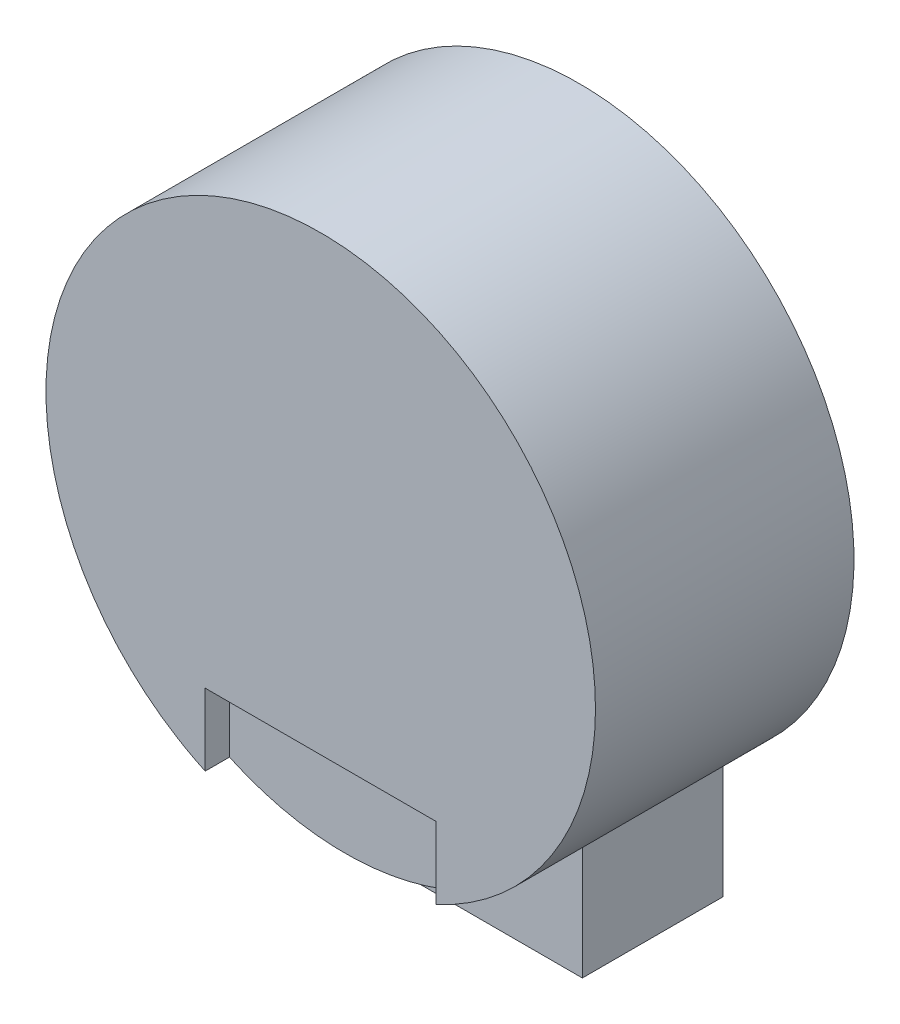
ISO-10303-21;
HEADER;
FILE_DESCRIPTION(('STEP AP214'),'2;1');
FILE_NAME('part.step','',(''),(''),'','','');
FILE_SCHEMA(('AUTOMOTIVE_DESIGN { 1 0 10303 214 1 1 1 1 }'));
ENDSEC;
DATA;
#1=APPLICATION_CONTEXT('core data for automotive mechanical design processes');
#2=APPLICATION_PROTOCOL_DEFINITION('international standard','automotive_design',2000,#1);
#3=PRODUCT_CONTEXT('',#1,'mechanical');
#4=PRODUCT('Part','Part','',(#3));
#5=PRODUCT_RELATED_PRODUCT_CATEGORY('part','',(#4));
#6=PRODUCT_DEFINITION_FORMATION('','',#4);
#7=PRODUCT_DEFINITION_CONTEXT('part definition',#1,'design');
#8=PRODUCT_DEFINITION('design','',#6,#7);
#9=PRODUCT_DEFINITION_SHAPE('','',#8);
#10=(LENGTH_UNIT() NAMED_UNIT(*) SI_UNIT(.MILLI.,.METRE.));
#11=(NAMED_UNIT(*) PLANE_ANGLE_UNIT() SI_UNIT($,.RADIAN.));
#12=(NAMED_UNIT(*) SI_UNIT($,.STERADIAN.) SOLID_ANGLE_UNIT());
#13=UNCERTAINTY_MEASURE_WITH_UNIT(LENGTH_MEASURE(1.E-05),#10,'distance_accuracy_value','');
#14=(GEOMETRIC_REPRESENTATION_CONTEXT(3) GLOBAL_UNCERTAINTY_ASSIGNED_CONTEXT((#13)) GLOBAL_UNIT_ASSIGNED_CONTEXT((#10,
#11,#12)) REPRESENTATION_CONTEXT('',''));
#15=CARTESIAN_POINT('',(0.,0.,0.));
#16=DIRECTION('',(0.,0.,1.));
#17=DIRECTION('',(1.,0.,0.));
#18=AXIS2_PLACEMENT_3D('',#15,#16,#17);
#19=CARTESIAN_POINT('',(0.,0.,2.25));
#20=DIRECTION('',(0.,0.,-1.));
#21=DIRECTION('',(-1.,0.,0.));
#22=AXIS2_PLACEMENT_3D('',#19,#20,#21);
#23=CYLINDRICAL_SURFACE('',#22,4.4);
#24=CARTESIAN_POINT('',(0.,0.,0.));
#25=DIRECTION('',(0.,0.,1.));
#26=DIRECTION('',(1.,0.,0.));
#27=AXIS2_PLACEMENT_3D('',#24,#25,#26);
#28=CIRCLE('',#27,4.4);
#29=CARTESIAN_POINT('',(2.3,-3.75099986670221,0.));
#30=VERTEX_POINT('',#29);
#31=CARTESIAN_POINT('',(-2.3,-3.75099986670221,0.));
#32=VERTEX_POINT('',#31);
#33=EDGE_CURVE('E214',#30,#32,#28,.T.);
#34=ORIENTED_EDGE('',*,*,#33,.T.);
#35=DIRECTION('',(0.,0.,-1.));
#36=VECTOR('',#35,1.);
#37=CARTESIAN_POINT('',(-2.3,-3.75099986670221,2.25));
#38=LINE('',#37,#36);
#39=CARTESIAN_POINT('',(-2.3,-3.75099986670221,2.25));
#40=VERTEX_POINT('',#39);
#41=EDGE_CURVE('E171',#40,#32,#38,.T.);
#42=ORIENTED_EDGE('',*,*,#41,.F.);
#43=CARTESIAN_POINT('',(0.,0.,2.25));
#44=DIRECTION('',(0.,0.,1.));
#45=DIRECTION('',(1.,0.,0.));
#46=AXIS2_PLACEMENT_3D('',#43,#44,#45);
#47=CIRCLE('',#46,4.4);
#48=CARTESIAN_POINT('',(2.3,-3.75099986670221,2.25));
#49=VERTEX_POINT('',#48);
#50=EDGE_CURVE('E151',#40,#49,#47,.T.);
#51=ORIENTED_EDGE('',*,*,#50,.T.);
#52=DIRECTION('',(0.,0.,-1.));
#53=VECTOR('',#52,1.);
#54=CARTESIAN_POINT('',(2.3,-3.75099986670221,2.25));
#55=LINE('',#54,#53);
#56=EDGE_CURVE('E177',#49,#30,#55,.T.);
#57=ORIENTED_EDGE('',*,*,#56,.T.);
#58=EDGE_LOOP('',(#34,#42,#51,#57));
#59=FACE_BOUND('',#58,.T.);
#60=CARTESIAN_POINT('',(0.,0.,3.75133301182728));
#61=DIRECTION('',(0.,0.,-1.));
#62=DIRECTION('',(-1.,0.,0.));
#63=AXIS2_PLACEMENT_3D('',#60,#61,#62);
#64=CIRCLE('',#63,4.4);
#65=CARTESIAN_POINT('',(1.85,-3.99217985566783,3.75133301182728));
#66=VERTEX_POINT('',#65);
#67=CARTESIAN_POINT('',(-1.85,-3.99217985566783,3.75133301182728));
#68=VERTEX_POINT('',#67);
#69=EDGE_CURVE('E11',#66,#68,#64,.T.);
#70=ORIENTED_EDGE('',*,*,#69,.T.);
#71=DIRECTION('',(0.,0.,-1.));
#72=VECTOR('',#71,1.);
#73=CARTESIAN_POINT('',(-1.85,-3.99217985566783,2.25));
#74=LINE('',#73,#72);
#75=CARTESIAN_POINT('',(-1.85,-3.99217985566783,4.14));
#76=VERTEX_POINT('',#75);
#77=EDGE_CURVE('E137',#68,#76,#74,.F.);
#78=ORIENTED_EDGE('',*,*,#77,.T.);
#79=CARTESIAN_POINT('',(0.,0.,4.14));
#80=DIRECTION('',(0.,0.,1.));
#81=DIRECTION('',(1.,0.,0.));
#82=AXIS2_PLACEMENT_3D('',#79,#80,#81);
#83=CIRCLE('',#82,4.4);
#84=CARTESIAN_POINT('',(1.85,-3.99217985566783,4.14));
#85=VERTEX_POINT('',#84);
#86=EDGE_CURVE('E152',#85,#76,#83,.T.);
#87=ORIENTED_EDGE('',*,*,#86,.F.);
#88=DIRECTION('',(0.,0.,-1.));
#89=VECTOR('',#88,1.);
#90=CARTESIAN_POINT('',(1.85,-3.99217985566783,2.25));
#91=LINE('',#90,#89);
#92=EDGE_CURVE('E146',#85,#66,#91,.T.);
#93=ORIENTED_EDGE('',*,*,#92,.T.);
#94=EDGE_LOOP('',(#70,#78,#87,#93));
#95=FACE_BOUND('',#94,.T.);
#96=ADVANCED_FACE('F36',(#59,#95),#23,.T.);
#97=CARTESIAN_POINT('',(-2.3,0.,2.25));
#98=DIRECTION('',(-1.,0.,0.));
#99=DIRECTION('',(0.,0.,1.));
#100=AXIS2_PLACEMENT_3D('',#97,#98,#99);
#101=PLANE('',#100);
#102=DIRECTION('',(0.,1.,0.));
#103=VECTOR('',#102,1.);
#104=CARTESIAN_POINT('',(-2.3,0.,0.));
#105=LINE('',#104,#103);
#106=CARTESIAN_POINT('',(-2.3,-5.73099986670221,0.));
#107=VERTEX_POINT('',#106);
#108=EDGE_CURVE('E220',#107,#32,#105,.T.);
#109=ORIENTED_EDGE('',*,*,#108,.F.);
#110=DIRECTION('',(0.,0.,-1.));
#111=VECTOR('',#110,1.);
#112=CARTESIAN_POINT('',(-2.3,-5.73099986670221,2.25));
#113=LINE('',#112,#111);
#114=CARTESIAN_POINT('',(-2.3,-5.73099986670221,2.25));
#115=VERTEX_POINT('',#114);
#116=EDGE_CURVE('E163',#115,#107,#113,.T.);
#117=ORIENTED_EDGE('',*,*,#116,.F.);
#118=DIRECTION('',(0.,1.,0.));
#119=VECTOR('',#118,1.);
#120=CARTESIAN_POINT('',(-2.3,0.,2.25));
#121=LINE('',#120,#119);
#122=EDGE_CURVE('E165',#115,#40,#121,.T.);
#123=ORIENTED_EDGE('',*,*,#122,.T.);
#124=ORIENTED_EDGE('',*,*,#41,.T.);
#125=EDGE_LOOP('',(#109,#117,#123,#124));
#126=FACE_BOUND('',#125,.T.);
#127=ADVANCED_FACE('F204',(#126),#101,.T.);
#128=CARTESIAN_POINT('',(0.,-5.73099986670221,2.25));
#129=DIRECTION('',(0.,1.,0.));
#130=DIRECTION('',(0.,0.,1.));
#131=AXIS2_PLACEMENT_3D('',#128,#129,#130);
#132=PLANE('',#131);
#133=DIRECTION('',(1.,0.,0.));
#134=VECTOR('',#133,1.);
#135=CARTESIAN_POINT('',(1.75,-5.73099986670221,0.7));
#136=LINE('',#135,#134);
#137=CARTESIAN_POINT('',(-1.75,-5.73099986670221,0.7));
#138=VERTEX_POINT('',#137);
#139=CARTESIAN_POINT('',(1.75,-5.73099986670221,0.7));
#140=VERTEX_POINT('',#139);
#141=EDGE_CURVE('E389',#138,#140,#136,.T.);
#142=ORIENTED_EDGE('',*,*,#141,.F.);
#143=DIRECTION('',(0.,0.,-1.));
#144=VECTOR('',#143,1.);
#145=CARTESIAN_POINT('',(-1.75,-5.73099986670221,1.2));
#146=LINE('',#145,#144);
#147=CARTESIAN_POINT('',(-1.75,-5.73099986670221,1.2));
#148=VERTEX_POINT('',#147);
#149=EDGE_CURVE('E58',#148,#138,#146,.T.);
#150=ORIENTED_EDGE('',*,*,#149,.F.);
#151=DIRECTION('',(-1.,0.,0.));
#152=VECTOR('',#151,1.);
#153=CARTESIAN_POINT('',(1.75,-5.73099986670221,1.2));
#154=LINE('',#153,#152);
#155=CARTESIAN_POINT('',(1.75,-5.73099986670221,1.2));
#156=VERTEX_POINT('',#155);
#157=EDGE_CURVE('E382',#156,#148,#154,.T.);
#158=ORIENTED_EDGE('',*,*,#157,.F.);
#159=DIRECTION('',(0.,0.,1.));
#160=VECTOR('',#159,1.);
#161=CARTESIAN_POINT('',(1.75,-5.73099986670221,1.2));
#162=LINE('',#161,#160);
#163=EDGE_CURVE('E385',#140,#156,#162,.T.);
#164=ORIENTED_EDGE('',*,*,#163,.F.);
#165=EDGE_LOOP('',(#142,#150,#158,#164));
#166=FACE_BOUND('',#165,.T.);
#167=DIRECTION('',(1.,0.,0.));
#168=VECTOR('',#167,1.);
#169=CARTESIAN_POINT('',(0.,-5.73099986670221,0.));
#170=LINE('',#169,#168);
#171=CARTESIAN_POINT('',(2.3,-5.73099986670221,0.));
#172=VERTEX_POINT('',#171);
#173=EDGE_CURVE('E226',#107,#172,#170,.T.);
#174=ORIENTED_EDGE('',*,*,#173,.T.);
#175=DIRECTION('',(0.,0.,-1.));
#176=VECTOR('',#175,1.);
#177=CARTESIAN_POINT('',(2.3,-5.73099986670221,2.25));
#178=LINE('',#177,#176);
#179=CARTESIAN_POINT('',(2.3,-5.73099986670221,2.25));
#180=VERTEX_POINT('',#179);
#181=EDGE_CURVE('E182',#180,#172,#178,.T.);
#182=ORIENTED_EDGE('',*,*,#181,.F.);
#183=DIRECTION('',(1.,0.,0.));
#184=VECTOR('',#183,1.);
#185=CARTESIAN_POINT('',(0.,-5.73099986670221,2.25));
#186=LINE('',#185,#184);
#187=EDGE_CURVE('E167',#115,#180,#186,.T.);
#188=ORIENTED_EDGE('',*,*,#187,.F.);
#189=ORIENTED_EDGE('',*,*,#116,.T.);
#190=EDGE_LOOP('',(#174,#182,#188,#189));
#191=FACE_BOUND('',#190,.T.);
#192=ADVANCED_FACE('F209',(#166,#191),#132,.F.);
#193=CARTESIAN_POINT('',(2.3,0.,2.25));
#194=DIRECTION('',(-1.,0.,0.));
#195=DIRECTION('',(0.,0.,1.));
#196=AXIS2_PLACEMENT_3D('',#193,#194,#195);
#197=PLANE('',#196);
#198=DIRECTION('',(0.,1.,0.));
#199=VECTOR('',#198,1.);
#200=CARTESIAN_POINT('',(2.3,0.,0.));
#201=LINE('',#200,#199);
#202=EDGE_CURVE('E168',#172,#30,#201,.T.);
#203=ORIENTED_EDGE('',*,*,#202,.T.);
#204=ORIENTED_EDGE('',*,*,#56,.F.);
#205=DIRECTION('',(0.,1.,0.));
#206=VECTOR('',#205,1.);
#207=CARTESIAN_POINT('',(2.3,0.,2.25));
#208=LINE('',#207,#206);
#209=EDGE_CURVE('E175',#180,#49,#208,.T.);
#210=ORIENTED_EDGE('',*,*,#209,.F.);
#211=ORIENTED_EDGE('',*,*,#181,.T.);
#212=EDGE_LOOP('',(#203,#204,#210,#211));
#213=FACE_BOUND('',#212,.T.);
#214=ADVANCED_FACE('F240',(#213),#197,.F.);
#215=CARTESIAN_POINT('',(0.,0.,2.25));
#216=DIRECTION('',(0.,0.,1.));
#217=DIRECTION('',(1.,0.,0.));
#218=AXIS2_PLACEMENT_3D('',#215,#216,#217);
#219=PLANE('',#218);
#220=ORIENTED_EDGE('',*,*,#50,.F.);
#221=ORIENTED_EDGE('',*,*,#122,.F.);
#222=ORIENTED_EDGE('',*,*,#187,.T.);
#223=ORIENTED_EDGE('',*,*,#209,.T.);
#224=EDGE_LOOP('',(#220,#221,#222,#223));
#225=FACE_BOUND('',#224,.T.);
#226=ADVANCED_FACE('F239',(#225),#219,.T.);
#227=CARTESIAN_POINT('',(0.,0.,0.));
#228=DIRECTION('',(0.,0.,1.));
#229=DIRECTION('',(1.,0.,0.));
#230=AXIS2_PLACEMENT_3D('',#227,#228,#229);
#231=PLANE('',#230);
#232=ORIENTED_EDGE('',*,*,#33,.F.);
#233=ORIENTED_EDGE('',*,*,#202,.F.);
#234=ORIENTED_EDGE('',*,*,#173,.F.);
#235=ORIENTED_EDGE('',*,*,#108,.T.);
#236=EDGE_LOOP('',(#232,#233,#234,#235));
#237=FACE_BOUND('',#236,.T.);
#238=ADVANCED_FACE('F225',(#237),#231,.F.);
#239=CARTESIAN_POINT('',(-1.75,-2.4418729391811,1.2));
#240=DIRECTION('',(-1.,0.,0.));
#241=DIRECTION('',(0.,0.,1.));
#242=AXIS2_PLACEMENT_3D('',#239,#240,#241);
#243=PLANE('',#242);
#244=ORIENTED_EDGE('',*,*,#149,.T.);
#245=DIRECTION('',(0.,-1.,0.));
#246=VECTOR('',#245,1.);
#247=CARTESIAN_POINT('',(-1.75,-2.4418729391811,0.7));
#248=LINE('',#247,#246);
#249=CARTESIAN_POINT('',(-1.75,-2.4418729391811,0.7));
#250=VERTEX_POINT('',#249);
#251=EDGE_CURVE('E398',#250,#138,#248,.T.);
#252=ORIENTED_EDGE('',*,*,#251,.F.);
#253=DIRECTION('',(0.,0.,-1.));
#254=VECTOR('',#253,1.);
#255=CARTESIAN_POINT('',(-1.75,-2.4418729391811,1.2));
#256=LINE('',#255,#254);
#257=CARTESIAN_POINT('',(-1.75,-2.4418729391811,1.2));
#258=VERTEX_POINT('',#257);
#259=EDGE_CURVE('E158',#258,#250,#256,.T.);
#260=ORIENTED_EDGE('',*,*,#259,.F.);
#261=DIRECTION('',(0.,-1.,0.));
#262=VECTOR('',#261,1.);
#263=CARTESIAN_POINT('',(-1.75,-2.4418729391811,1.2));
#264=LINE('',#263,#262);
#265=EDGE_CURVE('E221',#258,#148,#264,.T.);
#266=ORIENTED_EDGE('',*,*,#265,.T.);
#267=EDGE_LOOP('',(#244,#252,#260,#266));
#268=FACE_BOUND('',#267,.T.);
#269=ADVANCED_FACE('F252',(#268),#243,.F.);
#270=CARTESIAN_POINT('',(1.75,-2.4418729391811,1.2));
#271=DIRECTION('',(0.,0.,1.));
#272=DIRECTION('',(1.,0.,0.));
#273=AXIS2_PLACEMENT_3D('',#270,#271,#272);
#274=PLANE('',#273);
#275=ORIENTED_EDGE('',*,*,#157,.T.);
#276=ORIENTED_EDGE('',*,*,#265,.F.);
#277=DIRECTION('',(-1.,0.,0.));
#278=VECTOR('',#277,1.);
#279=CARTESIAN_POINT('',(1.75,-2.4418729391811,1.2));
#280=LINE('',#279,#278);
#281=CARTESIAN_POINT('',(1.75,-2.4418729391811,1.2));
#282=VERTEX_POINT('',#281);
#283=EDGE_CURVE('E381',#282,#258,#280,.T.);
#284=ORIENTED_EDGE('',*,*,#283,.F.);
#285=DIRECTION('',(0.,-1.,0.));
#286=VECTOR('',#285,1.);
#287=CARTESIAN_POINT('',(1.75,-2.4418729391811,1.2));
#288=LINE('',#287,#286);
#289=EDGE_CURVE('E394',#282,#156,#288,.T.);
#290=ORIENTED_EDGE('',*,*,#289,.T.);
#291=EDGE_LOOP('',(#275,#276,#284,#290));
#292=FACE_BOUND('',#291,.T.);
#293=ADVANCED_FACE('F256',(#292),#274,.F.);
#294=CARTESIAN_POINT('',(1.75,-2.4418729391811,1.2));
#295=DIRECTION('',(1.,0.,0.));
#296=DIRECTION('',(0.,0.,-1.));
#297=AXIS2_PLACEMENT_3D('',#294,#295,#296);
#298=PLANE('',#297);
#299=ORIENTED_EDGE('',*,*,#163,.T.);
#300=ORIENTED_EDGE('',*,*,#289,.F.);
#301=DIRECTION('',(0.,0.,1.));
#302=VECTOR('',#301,1.);
#303=CARTESIAN_POINT('',(1.75,-2.4418729391811,1.2));
#304=LINE('',#303,#302);
#305=CARTESIAN_POINT('',(1.75,-2.4418729391811,0.7));
#306=VERTEX_POINT('',#305);
#307=EDGE_CURVE('E383',#306,#282,#304,.T.);
#308=ORIENTED_EDGE('',*,*,#307,.F.);
#309=DIRECTION('',(0.,-1.,0.));
#310=VECTOR('',#309,1.);
#311=CARTESIAN_POINT('',(1.75,-2.4418729391811,0.7));
#312=LINE('',#311,#310);
#313=EDGE_CURVE('E396',#306,#140,#312,.T.);
#314=ORIENTED_EDGE('',*,*,#313,.T.);
#315=EDGE_LOOP('',(#299,#300,#308,#314));
#316=FACE_BOUND('',#315,.T.);
#317=ADVANCED_FACE('F261',(#316),#298,.F.);
#318=CARTESIAN_POINT('',(1.75,-2.4418729391811,0.7));
#319=DIRECTION('',(0.,0.,-1.));
#320=DIRECTION('',(-1.,0.,0.));
#321=AXIS2_PLACEMENT_3D('',#318,#319,#320);
#322=PLANE('',#321);
#323=ORIENTED_EDGE('',*,*,#141,.T.);
#324=ORIENTED_EDGE('',*,*,#313,.F.);
#325=DIRECTION('',(1.,0.,0.));
#326=VECTOR('',#325,1.);
#327=CARTESIAN_POINT('',(1.75,-2.4418729391811,0.7));
#328=LINE('',#327,#326);
#329=EDGE_CURVE('E379',#250,#306,#328,.T.);
#330=ORIENTED_EDGE('',*,*,#329,.F.);
#331=ORIENTED_EDGE('',*,*,#251,.T.);
#332=EDGE_LOOP('',(#323,#324,#330,#331));
#333=FACE_BOUND('',#332,.T.);
#334=ADVANCED_FACE('F257',(#333),#322,.F.);
#335=CARTESIAN_POINT('',(0.,-2.4418729391811,0.));
#336=DIRECTION('',(0.,1.,0.));
#337=DIRECTION('',(0.,0.,1.));
#338=AXIS2_PLACEMENT_3D('',#335,#336,#337);
#339=PLANE('',#338);
#340=ORIENTED_EDGE('',*,*,#259,.T.);
#341=ORIENTED_EDGE('',*,*,#329,.T.);
#342=ORIENTED_EDGE('',*,*,#307,.T.);
#343=ORIENTED_EDGE('',*,*,#283,.T.);
#344=EDGE_LOOP('',(#340,#341,#342,#343));
#345=FACE_BOUND('',#344,.T.);
#346=ADVANCED_FACE('F260',(#345),#339,.F.);
#347=CARTESIAN_POINT('',(0.,0.,4.14));
#348=DIRECTION('',(0.,0.,1.));
#349=DIRECTION('',(1.,0.,0.));
#350=AXIS2_PLACEMENT_3D('',#347,#348,#349);
#351=PLANE('',#350);
#352=DIRECTION('',(0.,-1.,0.));
#353=VECTOR('',#352,1.);
#354=CARTESIAN_POINT('',(-1.85,0.,4.14));
#355=LINE('',#354,#353);
#356=CARTESIAN_POINT('',(-1.85,-2.84099986670221,4.14));
#357=VERTEX_POINT('',#356);
#358=EDGE_CURVE('E43',#357,#76,#355,.T.);
#359=ORIENTED_EDGE('',*,*,#358,.F.);
#360=DIRECTION('',(-1.,0.,0.));
#361=VECTOR('',#360,1.);
#362=CARTESIAN_POINT('',(0.,-2.84099986670221,4.14));
#363=LINE('',#362,#361);
#364=CARTESIAN_POINT('',(1.85,-2.84099986670221,4.14));
#365=VERTEX_POINT('',#364);
#366=EDGE_CURVE('E129',#365,#357,#363,.T.);
#367=ORIENTED_EDGE('',*,*,#366,.F.);
#368=DIRECTION('',(0.,1.,0.));
#369=VECTOR('',#368,1.);
#370=CARTESIAN_POINT('',(1.85,0.,4.14));
#371=LINE('',#370,#369);
#372=EDGE_CURVE('E186',#85,#365,#371,.T.);
#373=ORIENTED_EDGE('',*,*,#372,.F.);
#374=ORIENTED_EDGE('',*,*,#86,.T.);
#375=EDGE_LOOP('',(#359,#367,#373,#374));
#376=FACE_BOUND('',#375,.T.);
#377=ADVANCED_FACE('F191',(#376),#351,.T.);
#378=CARTESIAN_POINT('',(1.85,-2.84099986670221,3.75133301182728));
#379=DIRECTION('',(0.,0.,-1.));
#380=DIRECTION('',(-1.,0.,0.));
#381=AXIS2_PLACEMENT_3D('',#378,#379,#380);
#382=PLANE('',#381);
#383=DIRECTION('',(0.,-1.,0.));
#384=VECTOR('',#383,1.);
#385=CARTESIAN_POINT('',(1.85,-2.84099986670221,3.75133301182728));
#386=LINE('',#385,#384);
#387=CARTESIAN_POINT('',(1.85,-2.84099986670221,3.75133301182728));
#388=VERTEX_POINT('',#387);
#389=EDGE_CURVE('E139',#388,#66,#386,.T.);
#390=ORIENTED_EDGE('',*,*,#389,.F.);
#391=DIRECTION('',(1.,0.,0.));
#392=VECTOR('',#391,1.);
#393=CARTESIAN_POINT('',(1.85,-2.84099986670221,3.75133301182728));
#394=LINE('',#393,#392);
#395=CARTESIAN_POINT('',(-1.85,-2.84099986670221,3.75133301182728));
#396=VERTEX_POINT('',#395);
#397=EDGE_CURVE('E127',#396,#388,#394,.T.);
#398=ORIENTED_EDGE('',*,*,#397,.F.);
#399=DIRECTION('',(0.,-1.,0.));
#400=VECTOR('',#399,1.);
#401=CARTESIAN_POINT('',(-1.85,-2.84099986670221,3.75133301182728));
#402=LINE('',#401,#400);
#403=EDGE_CURVE('E134',#396,#68,#402,.T.);
#404=ORIENTED_EDGE('',*,*,#403,.T.);
#405=ORIENTED_EDGE('',*,*,#69,.F.);
#406=EDGE_LOOP('',(#390,#398,#404,#405));
#407=FACE_BOUND('',#406,.T.);
#408=ADVANCED_FACE('F141',(#407),#382,.F.);
#409=CARTESIAN_POINT('',(-1.85,-2.84099986670221,5.03940543007619));
#410=DIRECTION('',(-1.,0.,0.));
#411=DIRECTION('',(0.,0.,1.));
#412=AXIS2_PLACEMENT_3D('',#409,#410,#411);
#413=PLANE('',#412);
#414=ORIENTED_EDGE('',*,*,#403,.F.);
#415=DIRECTION('',(0.,0.,-1.));
#416=VECTOR('',#415,1.);
#417=CARTESIAN_POINT('',(-1.85,-2.84099986670221,5.03940543007619));
#418=LINE('',#417,#416);
#419=EDGE_CURVE('E123',#357,#396,#418,.T.);
#420=ORIENTED_EDGE('',*,*,#419,.F.);
#421=ORIENTED_EDGE('',*,*,#358,.T.);
#422=ORIENTED_EDGE('',*,*,#77,.F.);
#423=EDGE_LOOP('',(#414,#420,#421,#422));
#424=FACE_BOUND('',#423,.T.);
#425=ADVANCED_FACE('F135',(#424),#413,.F.);
#426=CARTESIAN_POINT('',(1.85,-2.84099986670221,5.03940543007619));
#427=DIRECTION('',(1.,0.,0.));
#428=DIRECTION('',(0.,0.,-1.));
#429=AXIS2_PLACEMENT_3D('',#426,#427,#428);
#430=PLANE('',#429);
#431=ORIENTED_EDGE('',*,*,#372,.T.);
#432=DIRECTION('',(0.,0.,1.));
#433=VECTOR('',#432,1.);
#434=CARTESIAN_POINT('',(1.85,-2.84099986670221,5.03940543007619));
#435=LINE('',#434,#433);
#436=EDGE_CURVE('E50',#388,#365,#435,.T.);
#437=ORIENTED_EDGE('',*,*,#436,.F.);
#438=ORIENTED_EDGE('',*,*,#389,.T.);
#439=ORIENTED_EDGE('',*,*,#92,.F.);
#440=EDGE_LOOP('',(#431,#437,#438,#439));
#441=FACE_BOUND('',#440,.T.);
#442=ADVANCED_FACE('F193',(#441),#430,.F.);
#443=CARTESIAN_POINT('',(0.,-2.84099986670221,0.));
#444=DIRECTION('',(0.,1.,0.));
#445=DIRECTION('',(0.,0.,1.));
#446=AXIS2_PLACEMENT_3D('',#443,#444,#445);
#447=PLANE('',#446);
#448=ORIENTED_EDGE('',*,*,#366,.T.);
#449=ORIENTED_EDGE('',*,*,#419,.T.);
#450=ORIENTED_EDGE('',*,*,#397,.T.);
#451=ORIENTED_EDGE('',*,*,#436,.T.);
#452=EDGE_LOOP('',(#448,#449,#450,#451));
#453=FACE_BOUND('',#452,.T.);
#454=ADVANCED_FACE('F125',(#453),#447,.F.);
#455=CLOSED_SHELL('',(#96,#127,#192,#214,#226,#238,#269,#293,#317,#334,#346,#377,#408,#425,#442,#454));
#456=MANIFOLD_SOLID_BREP('B2',#455);
#457=ADVANCED_BREP_SHAPE_REPRESENTATION('',(#18,#456),#14);
#458=SHAPE_DEFINITION_REPRESENTATION(#9,#457);
ENDSEC;
END-ISO-10303-21;
